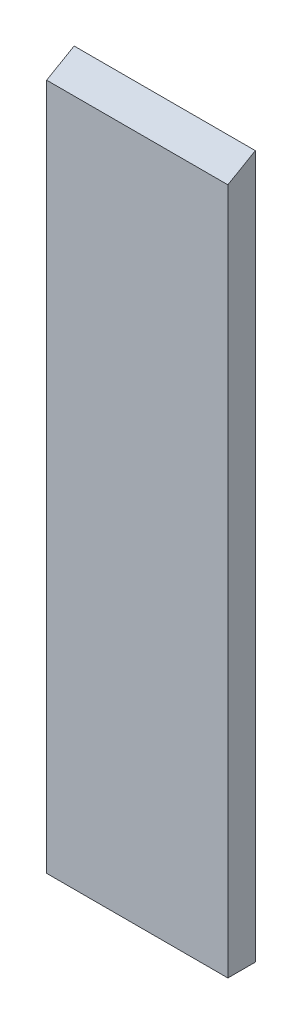
ISO-10303-21;
HEADER;
FILE_DESCRIPTION(('STEP AP214'),'2;1');
FILE_NAME('part.step','',(''),(''),'','','');
FILE_SCHEMA(('AUTOMOTIVE_DESIGN { 1 0 10303 214 1 1 1 1 }'));
ENDSEC;
DATA;
#1=APPLICATION_CONTEXT('core data for automotive mechanical design processes');
#2=APPLICATION_PROTOCOL_DEFINITION('international standard','automotive_design',2000,#1);
#3=PRODUCT_CONTEXT('',#1,'mechanical');
#4=PRODUCT('Part','Part','',(#3));
#5=PRODUCT_RELATED_PRODUCT_CATEGORY('part','',(#4));
#6=PRODUCT_DEFINITION_FORMATION('','',#4);
#7=PRODUCT_DEFINITION_CONTEXT('part definition',#1,'design');
#8=PRODUCT_DEFINITION('design','',#6,#7);
#9=PRODUCT_DEFINITION_SHAPE('','',#8);
#10=(LENGTH_UNIT() NAMED_UNIT(*) SI_UNIT(.MILLI.,.METRE.));
#11=(NAMED_UNIT(*) PLANE_ANGLE_UNIT() SI_UNIT($,.RADIAN.));
#12=(NAMED_UNIT(*) SI_UNIT($,.STERADIAN.) SOLID_ANGLE_UNIT());
#13=UNCERTAINTY_MEASURE_WITH_UNIT(LENGTH_MEASURE(1.E-05),#10,'distance_accuracy_value','');
#14=(GEOMETRIC_REPRESENTATION_CONTEXT(3) GLOBAL_UNCERTAINTY_ASSIGNED_CONTEXT((#13)) GLOBAL_UNIT_ASSIGNED_CONTEXT((#10,
#11,#12)) REPRESENTATION_CONTEXT('',''));
#15=CARTESIAN_POINT('',(0.,0.,0.));
#16=DIRECTION('',(0.,0.,1.));
#17=DIRECTION('',(1.,0.,0.));
#18=AXIS2_PLACEMENT_3D('',#15,#16,#17);
#19=CARTESIAN_POINT('',(-9.92187500000014,775.633,-44.677734375));
#20=DIRECTION('',(1.,0.,0.));
#21=DIRECTION('',(0.,0.,-1.));
#22=AXIS2_PLACEMENT_3D('',#19,#20,#21);
#23=PLANE('',#22);
#24=DIRECTION('',(0.,-1.,0.));
#25=VECTOR('',#24,1.);
#26=CARTESIAN_POINT('',(-9.92187500000013,775.633,-14.367734375));
#27=LINE('',#26,#25);
#28=CARTESIAN_POINT('',(-9.92187500000019,758.131460067754,-14.3677343750001));
#29=VERTEX_POINT('',#28);
#30=CARTESIAN_POINT('',(-9.92187500000013,0.,-14.367734375));
#31=VERTEX_POINT('',#30);
#32=EDGE_CURVE('E11',#29,#31,#27,.T.);
#33=ORIENTED_EDGE('',*,*,#32,.F.);
#34=DIRECTION('',(0.,0.500043998064175,-0.865999999999997));
#35=VECTOR('',#34,1.);
#36=CARTESIAN_POINT('',(-9.92187500000014,775.633,-44.677734375));
#37=LINE('',#36,#35);
#38=CARTESIAN_POINT('',(-9.92187500000019,775.633,-44.6777343749998));
#39=VERTEX_POINT('',#38);
#40=EDGE_CURVE('E95',#29,#39,#37,.T.);
#41=ORIENTED_EDGE('',*,*,#40,.T.);
#42=DIRECTION('',(0.,-1.,0.));
#43=VECTOR('',#42,1.);
#44=CARTESIAN_POINT('',(-9.92187500000014,775.633,-44.677734375));
#45=LINE('',#44,#43);
#46=CARTESIAN_POINT('',(-9.92187500000014,0.,-44.677734375));
#47=VERTEX_POINT('',#46);
#48=EDGE_CURVE('E81',#39,#47,#45,.T.);
#49=ORIENTED_EDGE('',*,*,#48,.T.);
#50=DIRECTION('',(0.,0.,1.));
#51=VECTOR('',#50,1.);
#52=CARTESIAN_POINT('',(-9.92187500000014,0.,-44.677734375));
#53=LINE('',#52,#51);
#54=EDGE_CURVE('E86',#47,#31,#53,.T.);
#55=ORIENTED_EDGE('',*,*,#54,.T.);
#56=EDGE_LOOP('',(#33,#41,#49,#55));
#57=FACE_BOUND('',#56,.T.);
#58=ADVANCED_FACE('F33',(#57),#23,.F.);
#59=CARTESIAN_POINT('',(-9.92187500000013,775.633,-14.367734375));
#60=DIRECTION('',(0.,0.,-1.));
#61=DIRECTION('',(-1.,0.,0.));
#62=AXIS2_PLACEMENT_3D('',#59,#60,#61);
#63=PLANE('',#62);
#64=DIRECTION('',(0.,-1.,0.));
#65=VECTOR('',#64,1.);
#66=CARTESIAN_POINT('',(190.078125,775.633,-14.367734375));
#67=LINE('',#66,#65);
#68=CARTESIAN_POINT('',(190.078125,758.131460067754,-14.367734375));
#69=VERTEX_POINT('',#68);
#70=CARTESIAN_POINT('',(190.078125,0.,-14.367734375));
#71=VERTEX_POINT('',#70);
#72=EDGE_CURVE('E41',#69,#71,#67,.T.);
#73=ORIENTED_EDGE('',*,*,#72,.F.);
#74=DIRECTION('',(1.,0.,0.));
#75=VECTOR('',#74,1.);
#76=CARTESIAN_POINT('',(-169.921875,758.131460067754,-14.3677343750002));
#77=LINE('',#76,#75);
#78=EDGE_CURVE('E100',#29,#69,#77,.T.);
#79=ORIENTED_EDGE('',*,*,#78,.F.);
#80=ORIENTED_EDGE('',*,*,#32,.T.);
#81=DIRECTION('',(1.,0.,0.));
#82=VECTOR('',#81,1.);
#83=CARTESIAN_POINT('',(-9.92187500000013,0.,-14.367734375));
#84=LINE('',#83,#82);
#85=EDGE_CURVE('E74',#31,#71,#84,.T.);
#86=ORIENTED_EDGE('',*,*,#85,.T.);
#87=EDGE_LOOP('',(#73,#79,#80,#86));
#88=FACE_BOUND('',#87,.T.);
#89=ADVANCED_FACE('F105',(#88),#63,.F.);
#90=CARTESIAN_POINT('',(190.078125,775.633,-44.677734375));
#91=DIRECTION('',(-1.,0.,0.));
#92=DIRECTION('',(0.,0.,1.));
#93=AXIS2_PLACEMENT_3D('',#90,#91,#92);
#94=PLANE('',#93);
#95=DIRECTION('',(0.,-1.,0.));
#96=VECTOR('',#95,1.);
#97=CARTESIAN_POINT('',(190.078125,775.633,-44.677734375));
#98=LINE('',#97,#96);
#99=CARTESIAN_POINT('',(190.078125,775.633,-44.677734375));
#100=VERTEX_POINT('',#99);
#101=CARTESIAN_POINT('',(190.078125,0.,-44.677734375));
#102=VERTEX_POINT('',#101);
#103=EDGE_CURVE('E66',#100,#102,#98,.T.);
#104=ORIENTED_EDGE('',*,*,#103,.F.);
#105=DIRECTION('',(0.,0.500043998064175,-0.865999999999997));
#106=VECTOR('',#105,1.);
#107=CARTESIAN_POINT('',(190.078125,775.633,-44.6777343749997));
#108=LINE('',#107,#106);
#109=EDGE_CURVE('E48',#69,#100,#108,.T.);
#110=ORIENTED_EDGE('',*,*,#109,.F.);
#111=ORIENTED_EDGE('',*,*,#72,.T.);
#112=DIRECTION('',(0.,0.,-1.));
#113=VECTOR('',#112,1.);
#114=CARTESIAN_POINT('',(190.078125,0.,-44.677734375));
#115=LINE('',#114,#113);
#116=EDGE_CURVE('E63',#71,#102,#115,.T.);
#117=ORIENTED_EDGE('',*,*,#116,.T.);
#118=EDGE_LOOP('',(#104,#110,#111,#117));
#119=FACE_BOUND('',#118,.T.);
#120=ADVANCED_FACE('F65',(#119),#94,.F.);
#121=CARTESIAN_POINT('',(-9.92187500000014,775.633,-44.677734375));
#122=DIRECTION('',(0.,0.,1.));
#123=DIRECTION('',(1.,0.,0.));
#124=AXIS2_PLACEMENT_3D('',#121,#122,#123);
#125=PLANE('',#124);
#126=DIRECTION('',(-1.,0.,0.));
#127=VECTOR('',#126,1.);
#128=CARTESIAN_POINT('',(-9.92187500000014,0.,-44.677734375));
#129=LINE('',#128,#127);
#130=EDGE_CURVE('E73',#102,#47,#129,.T.);
#131=ORIENTED_EDGE('',*,*,#130,.T.);
#132=ORIENTED_EDGE('',*,*,#48,.F.);
#133=DIRECTION('',(-1.,0.,0.));
#134=VECTOR('',#133,1.);
#135=CARTESIAN_POINT('',(-9.92187500000014,775.633,-44.677734375));
#136=LINE('',#135,#134);
#137=EDGE_CURVE('E80',#100,#39,#136,.T.);
#138=ORIENTED_EDGE('',*,*,#137,.F.);
#139=ORIENTED_EDGE('',*,*,#103,.T.);
#140=EDGE_LOOP('',(#131,#132,#138,#139));
#141=FACE_BOUND('',#140,.T.);
#142=ADVANCED_FACE('F77',(#141),#125,.F.);
#143=CARTESIAN_POINT('',(0.,0.,0.));
#144=DIRECTION('',(0.,1.,0.));
#145=DIRECTION('',(0.,0.,1.));
#146=AXIS2_PLACEMENT_3D('',#143,#144,#145);
#147=PLANE('',#146);
#148=ORIENTED_EDGE('',*,*,#54,.F.);
#149=ORIENTED_EDGE('',*,*,#130,.F.);
#150=ORIENTED_EDGE('',*,*,#116,.F.);
#151=ORIENTED_EDGE('',*,*,#85,.F.);
#152=EDGE_LOOP('',(#148,#149,#150,#151));
#153=FACE_BOUND('',#152,.T.);
#154=ADVANCED_FACE('F84',(#153),#147,.F.);
#155=CARTESIAN_POINT('',(-169.921875,775.633,-44.6777343749999));
#156=DIRECTION('',(0.,-0.865999999999997,-0.500043998064175));
#157=DIRECTION('',(0.,0.500043998064175,-0.865999999999997));
#158=AXIS2_PLACEMENT_3D('',#155,#156,#157);
#159=PLANE('',#158);
#160=ORIENTED_EDGE('',*,*,#78,.T.);
#161=ORIENTED_EDGE('',*,*,#109,.T.);
#162=ORIENTED_EDGE('',*,*,#137,.T.);
#163=ORIENTED_EDGE('',*,*,#40,.F.);
#164=EDGE_LOOP('',(#160,#161,#162,#163));
#165=FACE_BOUND('',#164,.T.);
#166=ADVANCED_FACE('F101',(#165),#159,.F.);
#167=CLOSED_SHELL('',(#58,#89,#120,#142,#154,#166));
#168=MANIFOLD_SOLID_BREP('B2',#167);
#169=ADVANCED_BREP_SHAPE_REPRESENTATION('',(#18,#168),#14);
#170=SHAPE_DEFINITION_REPRESENTATION(#9,#169);
ENDSEC;
END-ISO-10303-21;
